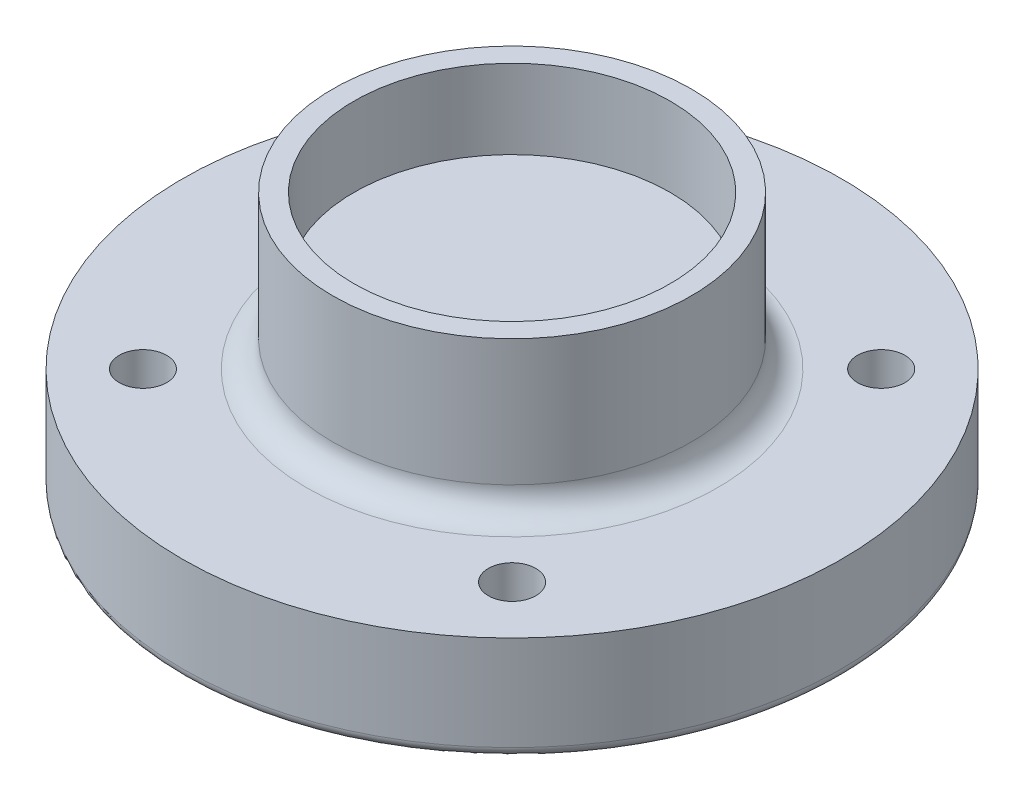
ISO-10303-21;
HEADER;
FILE_DESCRIPTION(('STEP AP214'),'2;1');
FILE_NAME('part.step','',(''),(''),'','','');
FILE_SCHEMA(('AUTOMOTIVE_DESIGN { 1 0 10303 214 1 1 1 1 }'));
ENDSEC;
DATA;
#1=APPLICATION_CONTEXT('core data for automotive mechanical design processes');
#2=APPLICATION_PROTOCOL_DEFINITION('international standard','automotive_design',2000,#1);
#3=PRODUCT_CONTEXT('',#1,'mechanical');
#4=PRODUCT('Part','Part','',(#3));
#5=PRODUCT_RELATED_PRODUCT_CATEGORY('part','',(#4));
#6=PRODUCT_DEFINITION_FORMATION('','',#4);
#7=PRODUCT_DEFINITION_CONTEXT('part definition',#1,'design');
#8=PRODUCT_DEFINITION('design','',#6,#7);
#9=PRODUCT_DEFINITION_SHAPE('','',#8);
#10=(LENGTH_UNIT() NAMED_UNIT(*) SI_UNIT(.MILLI.,.METRE.));
#11=(NAMED_UNIT(*) PLANE_ANGLE_UNIT() SI_UNIT($,.RADIAN.));
#12=(NAMED_UNIT(*) SI_UNIT($,.STERADIAN.) SOLID_ANGLE_UNIT());
#13=UNCERTAINTY_MEASURE_WITH_UNIT(LENGTH_MEASURE(1.E-05),#10,'distance_accuracy_value','');
#14=(GEOMETRIC_REPRESENTATION_CONTEXT(3) GLOBAL_UNCERTAINTY_ASSIGNED_CONTEXT((#13)) GLOBAL_UNIT_ASSIGNED_CONTEXT((#10,
#11,#12)) REPRESENTATION_CONTEXT('',''));
#15=CARTESIAN_POINT('',(0.,0.,0.));
#16=DIRECTION('',(0.,0.,1.));
#17=DIRECTION('',(1.,0.,0.));
#18=AXIS2_PLACEMENT_3D('',#15,#16,#17);
#19=CARTESIAN_POINT('',(0.,20.,0.));
#20=DIRECTION('',(0.,-1.,0.));
#21=DIRECTION('',(0.,0.,-1.));
#22=AXIS2_PLACEMENT_3D('',#19,#20,#21);
#23=CYLINDRICAL_SURFACE('',#22,62.5);
#24=CARTESIAN_POINT('',(0.,2.,0.));
#25=DIRECTION('',(0.,1.,0.));
#26=DIRECTION('',(0.,0.,1.));
#27=AXIS2_PLACEMENT_3D('',#24,#25,#26);
#28=CIRCLE('',#27,62.5);
#29=CARTESIAN_POINT('',(0.,2.,62.5));
#30=VERTEX_POINT('',#29);
#31=EDGE_CURVE('E38',#30,#30,#28,.T.);
#32=ORIENTED_EDGE('',*,*,#31,.T.);
#33=EDGE_LOOP('',(#32));
#34=FACE_BOUND('',#33,.T.);
#35=CARTESIAN_POINT('',(0.,20.,0.));
#36=DIRECTION('',(0.,1.,0.));
#37=DIRECTION('',(0.,0.,1.));
#38=AXIS2_PLACEMENT_3D('',#35,#36,#37);
#39=CIRCLE('',#38,62.5);
#40=CARTESIAN_POINT('',(0.,20.,62.5));
#41=VERTEX_POINT('',#40);
#42=EDGE_CURVE('E71',#41,#41,#39,.T.);
#43=ORIENTED_EDGE('',*,*,#42,.F.);
#44=EDGE_LOOP('',(#43));
#45=FACE_BOUND('',#44,.T.);
#46=ADVANCED_FACE('F31',(#34,#45),#23,.T.);
#47=CARTESIAN_POINT('',(0.,20.,0.));
#48=DIRECTION('',(0.,1.,0.));
#49=DIRECTION('',(0.,0.,1.));
#50=AXIS2_PLACEMENT_3D('',#47,#48,#49);
#51=PLANE('',#50);
#52=CARTESIAN_POINT('',(-35.,20.,35.));
#53=DIRECTION('',(0.,1.,0.));
#54=DIRECTION('',(0.,0.,1.));
#55=AXIS2_PLACEMENT_3D('',#52,#53,#54);
#56=CIRCLE('',#55,4.5);
#57=CARTESIAN_POINT('',(-35.,20.,39.5));
#58=VERTEX_POINT('',#57);
#59=EDGE_CURVE('E49',#58,#58,#56,.T.);
#60=ORIENTED_EDGE('',*,*,#59,.F.);
#61=EDGE_LOOP('',(#60));
#62=FACE_BOUND('',#61,.T.);
#63=CARTESIAN_POINT('',(35.,20.,35.));
#64=DIRECTION('',(0.,1.,0.));
#65=DIRECTION('',(0.,0.,1.));
#66=AXIS2_PLACEMENT_3D('',#63,#64,#65);
#67=CIRCLE('',#66,4.5);
#68=CARTESIAN_POINT('',(35.,20.,39.5));
#69=VERTEX_POINT('',#68);
#70=EDGE_CURVE('E54',#69,#69,#67,.T.);
#71=ORIENTED_EDGE('',*,*,#70,.F.);
#72=EDGE_LOOP('',(#71));
#73=FACE_BOUND('',#72,.T.);
#74=CARTESIAN_POINT('',(35.,20.,-35.));
#75=DIRECTION('',(0.,1.,0.));
#76=DIRECTION('',(0.,0.,1.));
#77=AXIS2_PLACEMENT_3D('',#74,#75,#76);
#78=CIRCLE('',#77,4.5);
#79=CARTESIAN_POINT('',(35.,20.,-30.5));
#80=VERTEX_POINT('',#79);
#81=EDGE_CURVE('E59',#80,#80,#78,.T.);
#82=ORIENTED_EDGE('',*,*,#81,.F.);
#83=EDGE_LOOP('',(#82));
#84=FACE_BOUND('',#83,.T.);
#85=CARTESIAN_POINT('',(-35.,20.,-35.));
#86=DIRECTION('',(0.,1.,0.));
#87=DIRECTION('',(0.,0.,1.));
#88=AXIS2_PLACEMENT_3D('',#85,#86,#87);
#89=CIRCLE('',#88,4.5);
#90=CARTESIAN_POINT('',(-35.,20.,-30.5));
#91=VERTEX_POINT('',#90);
#92=EDGE_CURVE('E64',#91,#91,#89,.T.);
#93=ORIENTED_EDGE('',*,*,#92,.F.);
#94=EDGE_LOOP('',(#93));
#95=FACE_BOUND('',#94,.T.);
#96=CARTESIAN_POINT('',(0.,20.,0.));
#97=DIRECTION('',(0.,1.,0.));
#98=DIRECTION('',(0.,0.,1.));
#99=AXIS2_PLACEMENT_3D('',#96,#97,#98);
#100=CIRCLE('',#99,39.);
#101=CARTESIAN_POINT('',(0.,20.,39.));
#102=VERTEX_POINT('',#101);
#103=EDGE_CURVE('E42',#102,#102,#100,.F.);
#104=ORIENTED_EDGE('',*,*,#103,.T.);
#105=EDGE_LOOP('',(#104));
#106=FACE_BOUND('',#105,.T.);
#107=ORIENTED_EDGE('',*,*,#42,.T.);
#108=EDGE_LOOP('',(#107));
#109=FACE_BOUND('',#108,.T.);
#110=ADVANCED_FACE('F118',(#62,#73,#84,#95,#106,#109),#51,.T.);
#111=CARTESIAN_POINT('',(0.,0.,0.));
#112=DIRECTION('',(0.,1.,0.));
#113=DIRECTION('',(0.,0.,1.));
#114=AXIS2_PLACEMENT_3D('',#111,#112,#113);
#115=PLANE('',#114);
#116=CARTESIAN_POINT('',(0.,0.,0.));
#117=DIRECTION('',(0.,1.,0.));
#118=DIRECTION('',(0.,0.,1.));
#119=AXIS2_PLACEMENT_3D('',#116,#117,#118);
#120=CIRCLE('',#119,60.5);
#121=CARTESIAN_POINT('',(0.,0.,60.5));
#122=VERTEX_POINT('',#121);
#123=EDGE_CURVE('E10',#122,#122,#120,.F.);
#124=ORIENTED_EDGE('',*,*,#123,.T.);
#125=EDGE_LOOP('',(#124));
#126=FACE_BOUND('',#125,.T.);
#127=CARTESIAN_POINT('',(-35.,0.,35.));
#128=DIRECTION('',(0.,-1.,0.));
#129=DIRECTION('',(0.,0.,-1.));
#130=AXIS2_PLACEMENT_3D('',#127,#128,#129);
#131=CIRCLE('',#130,9.0055);
#132=CARTESIAN_POINT('',(-35.,0.,25.9945));
#133=VERTEX_POINT('',#132);
#134=EDGE_CURVE('E108',#133,#133,#131,.T.);
#135=ORIENTED_EDGE('',*,*,#134,.F.);
#136=EDGE_LOOP('',(#135));
#137=FACE_BOUND('',#136,.T.);
#138=CARTESIAN_POINT('',(35.,0.,35.));
#139=DIRECTION('',(0.,-1.,0.));
#140=DIRECTION('',(0.,0.,-1.));
#141=AXIS2_PLACEMENT_3D('',#138,#139,#140);
#142=CIRCLE('',#141,9.0055);
#143=CARTESIAN_POINT('',(35.,0.,25.9945));
#144=VERTEX_POINT('',#143);
#145=EDGE_CURVE('E52',#144,#144,#142,.T.);
#146=ORIENTED_EDGE('',*,*,#145,.F.);
#147=EDGE_LOOP('',(#146));
#148=FACE_BOUND('',#147,.T.);
#149=CARTESIAN_POINT('',(35.,0.,-35.));
#150=DIRECTION('',(0.,-1.,0.));
#151=DIRECTION('',(0.,0.,-1.));
#152=AXIS2_PLACEMENT_3D('',#149,#150,#151);
#153=CIRCLE('',#152,9.0055);
#154=CARTESIAN_POINT('',(35.,0.,-44.0055));
#155=VERTEX_POINT('',#154);
#156=EDGE_CURVE('E57',#155,#155,#153,.T.);
#157=ORIENTED_EDGE('',*,*,#156,.F.);
#158=EDGE_LOOP('',(#157));
#159=FACE_BOUND('',#158,.T.);
#160=CARTESIAN_POINT('',(-35.,0.,-35.));
#161=DIRECTION('',(0.,-1.,0.));
#162=DIRECTION('',(0.,0.,-1.));
#163=AXIS2_PLACEMENT_3D('',#160,#161,#162);
#164=CIRCLE('',#163,9.0055);
#165=CARTESIAN_POINT('',(-35.,0.,-44.0055));
#166=VERTEX_POINT('',#165);
#167=EDGE_CURVE('E62',#166,#166,#164,.T.);
#168=ORIENTED_EDGE('',*,*,#167,.F.);
#169=EDGE_LOOP('',(#168));
#170=FACE_BOUND('',#169,.T.);
#171=ADVANCED_FACE('F114',(#126,#137,#148,#159,#170),#115,.F.);
#172=CARTESIAN_POINT('',(0.,49.,0.));
#173=DIRECTION('',(0.,-1.,0.));
#174=DIRECTION('',(0.,0.,-1.));
#175=AXIS2_PLACEMENT_3D('',#172,#173,#174);
#176=CYLINDRICAL_SURFACE('',#175,34.);
#177=CARTESIAN_POINT('',(0.,25.,0.));
#178=DIRECTION('',(0.,1.,0.));
#179=DIRECTION('',(0.,0.,1.));
#180=AXIS2_PLACEMENT_3D('',#177,#178,#179);
#181=CIRCLE('',#180,34.);
#182=CARTESIAN_POINT('',(0.,25.,-34.));
#183=VERTEX_POINT('',#182);
#184=EDGE_CURVE('E46',#183,#183,#181,.T.);
#185=CARTESIAN_POINT('',(0.,49.,0.));
#186=DIRECTION('',(0.,1.,0.));
#187=DIRECTION('',(0.,0.,1.));
#188=AXIS2_PLACEMENT_3D('',#185,#186,#187);
#189=CIRCLE('',#188,34.);
#190=CARTESIAN_POINT('',(0.,49.,-34.));
#191=VERTEX_POINT('',#190);
#192=EDGE_CURVE('E74',#191,#191,#189,.T.);
#193=CARTESIAN_POINT('',(0.,25.,-34.));
#194=CARTESIAN_POINT('',(0.,25.25,-34.));
#195=CARTESIAN_POINT('',(0.,25.5,-34.));
#196=CARTESIAN_POINT('',(0.,26.,-34.));
#197=CARTESIAN_POINT('',(0.,26.25,-34.));
#198=CARTESIAN_POINT('',(0.,26.75,-34.));
#199=CARTESIAN_POINT('',(0.,27.,-34.));
#200=CARTESIAN_POINT('',(0.,27.5,-34.));
#201=CARTESIAN_POINT('',(0.,27.75,-34.));
#202=CARTESIAN_POINT('',(0.,28.25,-34.));
#203=CARTESIAN_POINT('',(0.,28.5,-34.));
#204=CARTESIAN_POINT('',(0.,29.,-34.));
#205=CARTESIAN_POINT('',(0.,29.25,-34.));
#206=CARTESIAN_POINT('',(0.,29.75,-34.));
#207=CARTESIAN_POINT('',(0.,30.,-34.));
#208=CARTESIAN_POINT('',(0.,30.5,-34.));
#209=CARTESIAN_POINT('',(0.,30.75,-34.));
#210=CARTESIAN_POINT('',(0.,31.25,-34.));
#211=CARTESIAN_POINT('',(0.,31.5,-34.));
#212=CARTESIAN_POINT('',(0.,32.,-34.));
#213=CARTESIAN_POINT('',(0.,32.25,-34.));
#214=CARTESIAN_POINT('',(0.,32.75,-34.));
#215=CARTESIAN_POINT('',(0.,33.,-34.));
#216=CARTESIAN_POINT('',(0.,33.5,-34.));
#217=CARTESIAN_POINT('',(0.,33.75,-34.));
#218=CARTESIAN_POINT('',(0.,34.25,-34.));
#219=CARTESIAN_POINT('',(0.,34.5,-34.));
#220=CARTESIAN_POINT('',(0.,35.,-34.));
#221=CARTESIAN_POINT('',(0.,35.25,-34.));
#222=CARTESIAN_POINT('',(0.,35.75,-34.));
#223=CARTESIAN_POINT('',(0.,36.,-34.));
#224=CARTESIAN_POINT('',(0.,36.5,-34.));
#225=CARTESIAN_POINT('',(0.,36.75,-34.));
#226=CARTESIAN_POINT('',(0.,37.25,-34.));
#227=CARTESIAN_POINT('',(0.,37.5,-34.));
#228=CARTESIAN_POINT('',(0.,38.,-34.));
#229=CARTESIAN_POINT('',(0.,38.25,-34.));
#230=CARTESIAN_POINT('',(0.,38.75,-34.));
#231=CARTESIAN_POINT('',(0.,39.,-34.));
#232=CARTESIAN_POINT('',(0.,39.5,-34.));
#233=CARTESIAN_POINT('',(0.,39.75,-34.));
#234=CARTESIAN_POINT('',(0.,40.25,-34.));
#235=CARTESIAN_POINT('',(0.,40.5,-34.));
#236=CARTESIAN_POINT('',(0.,41.,-34.));
#237=CARTESIAN_POINT('',(0.,41.25,-34.));
#238=CARTESIAN_POINT('',(0.,41.75,-34.));
#239=CARTESIAN_POINT('',(0.,42.,-34.));
#240=CARTESIAN_POINT('',(0.,42.5,-34.));
#241=CARTESIAN_POINT('',(0.,42.75,-34.));
#242=CARTESIAN_POINT('',(0.,43.25,-34.));
#243=CARTESIAN_POINT('',(0.,43.5,-34.));
#244=CARTESIAN_POINT('',(0.,44.,-34.));
#245=CARTESIAN_POINT('',(0.,44.25,-34.));
#246=CARTESIAN_POINT('',(0.,44.75,-34.));
#247=CARTESIAN_POINT('',(0.,45.,-34.));
#248=CARTESIAN_POINT('',(0.,45.5,-34.));
#249=CARTESIAN_POINT('',(0.,45.75,-34.));
#250=CARTESIAN_POINT('',(0.,46.25,-34.));
#251=CARTESIAN_POINT('',(0.,46.5,-34.));
#252=CARTESIAN_POINT('',(0.,47.,-34.));
#253=CARTESIAN_POINT('',(0.,47.25,-34.));
#254=CARTESIAN_POINT('',(0.,47.75,-34.));
#255=CARTESIAN_POINT('',(0.,48.,-34.));
#256=CARTESIAN_POINT('',(0.,48.5,-34.));
#257=CARTESIAN_POINT('',(0.,48.75,-34.));
#258=CARTESIAN_POINT('',(0.,49.,-34.));
#259=B_SPLINE_CURVE_WITH_KNOTS('',3,(#193,#194,#195,#196,#197,#198,#199,#200,#201,#202,#203,
#204,#205,#206,#207,#208,#209,#210,#211,#212,#213,#214,#215,#216,#217,#218,#219,#220,#221,#222,
#223,#224,#225,#226,#227,#228,#229,#230,#231,#232,#233,#234,#235,#236,#237,#238,#239,#240,#241,
#242,#243,#244,#245,#246,#247,#248,#249,#250,#251,#252,#253,#254,#255,#256,#257,#258),
.UNSPECIFIED.,.F.,.F.,(4,2,2,2,2,2,2,2,2,2,2,2,2,2,2,2,2,2,2,2,2,2,2,2,2,2,2,2,2,2,2,2,4),(0.,
0.750000000000001,1.5,2.25,3.,3.75,4.5,5.25,6.,6.75,7.5,8.25,9.,9.75,10.5,11.25,12.,12.75,13.5,
14.25,15.,15.75,16.5,17.25,18.,18.75,19.5,20.25,21.,21.75,22.5,23.25,24.),.UNSPECIFIED.);
#260=EDGE_CURVE('BSEAM117',#183,#191,#259,.T.);
#261=ORIENTED_EDGE('',*,*,#184,.T.);
#262=ORIENTED_EDGE('',*,*,#192,.F.);
#263=ORIENTED_EDGE('',*,*,#260,.T.);
#264=ORIENTED_EDGE('',*,*,#260,.F.);
#265=EDGE_LOOP('',(#261,#263,#262,#264));
#266=FACE_BOUND('',#265,.T.);
#267=ADVANCED_FACE('F117',(#266),#176,.T.);
#268=CARTESIAN_POINT('',(0.,49.,0.));
#269=DIRECTION('',(0.,1.,0.));
#270=DIRECTION('',(0.,0.,1.));
#271=AXIS2_PLACEMENT_3D('',#268,#269,#270);
#272=PLANE('',#271);
#273=CARTESIAN_POINT('',(0.,49.,0.));
#274=DIRECTION('',(0.,1.,0.));
#275=DIRECTION('',(0.,0.,1.));
#276=AXIS2_PLACEMENT_3D('',#273,#274,#275);
#277=CIRCLE('',#276,30.);
#278=CARTESIAN_POINT('',(0.,49.,30.));
#279=VERTEX_POINT('',#278);
#280=EDGE_CURVE('E66',#279,#279,#277,.T.);
#281=ORIENTED_EDGE('',*,*,#280,.F.);
#282=EDGE_LOOP('',(#281));
#283=FACE_BOUND('',#282,.T.);
#284=ORIENTED_EDGE('',*,*,#192,.T.);
#285=EDGE_LOOP('',(#284));
#286=FACE_BOUND('',#285,.T.);
#287=ADVANCED_FACE('F170',(#283,#286),#272,.T.);
#288=CARTESIAN_POINT('',(0.,34.,0.));
#289=DIRECTION('',(0.,1.,0.));
#290=DIRECTION('',(0.,0.,1.));
#291=AXIS2_PLACEMENT_3D('',#288,#289,#290);
#292=CYLINDRICAL_SURFACE('',#291,30.);
#293=CARTESIAN_POINT('',(0.,34.,0.));
#294=DIRECTION('',(0.,1.,0.));
#295=DIRECTION('',(0.,0.,1.));
#296=AXIS2_PLACEMENT_3D('',#293,#294,#295);
#297=CIRCLE('',#296,30.);
#298=CARTESIAN_POINT('',(0.,34.,30.));
#299=VERTEX_POINT('',#298);
#300=EDGE_CURVE('E77',#299,#299,#297,.T.);
#301=ORIENTED_EDGE('',*,*,#300,.F.);
#302=EDGE_LOOP('',(#301));
#303=FACE_BOUND('',#302,.T.);
#304=ORIENTED_EDGE('',*,*,#280,.T.);
#305=EDGE_LOOP('',(#304));
#306=FACE_BOUND('',#305,.T.);
#307=ADVANCED_FACE('F161',(#303,#306),#292,.F.);
#308=CARTESIAN_POINT('',(0.,34.,0.));
#309=DIRECTION('',(0.,1.,0.));
#310=DIRECTION('',(0.,0.,1.));
#311=AXIS2_PLACEMENT_3D('',#308,#309,#310);
#312=PLANE('',#311);
#313=ORIENTED_EDGE('',*,*,#300,.T.);
#314=EDGE_LOOP('',(#313));
#315=FACE_BOUND('',#314,.T.);
#316=ADVANCED_FACE('F153',(#315),#312,.T.);
#317=CARTESIAN_POINT('',(0.,25.,0.));
#318=DIRECTION('',(0.,1.,0.));
#319=DIRECTION('',(0.,0.,1.));
#320=AXIS2_PLACEMENT_3D('',#317,#318,#319);
#321=TOROIDAL_SURFACE('',#320,39.,5.);
#322=ORIENTED_EDGE('',*,*,#103,.F.);
#323=EDGE_LOOP('',(#322));
#324=FACE_BOUND('',#323,.T.);
#325=ORIENTED_EDGE('',*,*,#184,.F.);
#326=EDGE_LOOP('',(#325));
#327=FACE_BOUND('',#326,.T.);
#328=ADVANCED_FACE('F151',(#324,#327),#321,.F.);
#329=CARTESIAN_POINT('',(-35.,0.,-35.));
#330=DIRECTION('',(0.,-1.,0.));
#331=DIRECTION('',(0.,0.,-1.));
#332=AXIS2_PLACEMENT_3D('',#329,#330,#331);
#333=CYLINDRICAL_SURFACE('',#332,4.5);
#334=ORIENTED_EDGE('',*,*,#92,.T.);
#335=EDGE_LOOP('',(#334));
#336=FACE_BOUND('',#335,.T.);
#337=CARTESIAN_POINT('',(-35.,5.3,-35.));
#338=DIRECTION('',(0.,-1.,0.));
#339=DIRECTION('',(0.,0.,-1.));
#340=AXIS2_PLACEMENT_3D('',#337,#338,#339);
#341=CIRCLE('',#340,4.50000000000001);
#342=CARTESIAN_POINT('',(-35.,5.3,-39.5));
#343=VERTEX_POINT('',#342);
#344=EDGE_CURVE('E67',#343,#343,#341,.T.);
#345=ORIENTED_EDGE('',*,*,#344,.T.);
#346=EDGE_LOOP('',(#345));
#347=FACE_BOUND('',#346,.T.);
#348=ADVANCED_FACE('F139',(#336,#347),#333,.F.);
#349=CARTESIAN_POINT('',(-30.5,5.3,-35.));
#350=DIRECTION('',(0.,1.,0.));
#351=DIRECTION('',(0.,0.,1.));
#352=AXIS2_PLACEMENT_3D('',#349,#350,#351);
#353=PLANE('',#352);
#354=ORIENTED_EDGE('',*,*,#344,.F.);
#355=EDGE_LOOP('',(#354));
#356=FACE_BOUND('',#355,.T.);
#357=CARTESIAN_POINT('',(-35.,5.3,-35.));
#358=DIRECTION('',(0.,-1.,0.));
#359=DIRECTION('',(0.,0.,-1.));
#360=AXIS2_PLACEMENT_3D('',#357,#358,#359);
#361=CIRCLE('',#360,9.0055);
#362=CARTESIAN_POINT('',(-35.,5.3,-44.0055));
#363=VERTEX_POINT('',#362);
#364=EDGE_CURVE('E84',#363,#363,#361,.T.);
#365=ORIENTED_EDGE('',*,*,#364,.T.);
#366=EDGE_LOOP('',(#365));
#367=FACE_BOUND('',#366,.T.);
#368=ADVANCED_FACE('F129',(#356,#367),#353,.F.);
#369=CARTESIAN_POINT('',(-35.,0.,-35.));
#370=DIRECTION('',(0.,-1.,0.));
#371=DIRECTION('',(0.,0.,-1.));
#372=AXIS2_PLACEMENT_3D('',#369,#370,#371);
#373=CYLINDRICAL_SURFACE('',#372,9.0055);
#374=ORIENTED_EDGE('',*,*,#364,.F.);
#375=EDGE_LOOP('',(#374));
#376=FACE_BOUND('',#375,.T.);
#377=ORIENTED_EDGE('',*,*,#167,.T.);
#378=EDGE_LOOP('',(#377));
#379=FACE_BOUND('',#378,.T.);
#380=ADVANCED_FACE('F126',(#376,#379),#373,.F.);
#381=CARTESIAN_POINT('',(35.,0.,-35.));
#382=DIRECTION('',(0.,-1.,0.));
#383=DIRECTION('',(0.,0.,-1.));
#384=AXIS2_PLACEMENT_3D('',#381,#382,#383);
#385=CYLINDRICAL_SURFACE('',#384,4.5);
#386=ORIENTED_EDGE('',*,*,#81,.T.);
#387=EDGE_LOOP('',(#386));
#388=FACE_BOUND('',#387,.T.);
#389=CARTESIAN_POINT('',(35.,5.3,-35.));
#390=DIRECTION('',(0.,-1.,0.));
#391=DIRECTION('',(0.,0.,-1.));
#392=AXIS2_PLACEMENT_3D('',#389,#390,#391);
#393=CIRCLE('',#392,4.50000000000001);
#394=CARTESIAN_POINT('',(35.,5.3,-39.5));
#395=VERTEX_POINT('',#394);
#396=EDGE_CURVE('E63',#395,#395,#393,.T.);
#397=ORIENTED_EDGE('',*,*,#396,.T.);
#398=EDGE_LOOP('',(#397));
#399=FACE_BOUND('',#398,.T.);
#400=ADVANCED_FACE('F128',(#388,#399),#385,.F.);
#401=CARTESIAN_POINT('',(39.5,5.3,-35.));
#402=DIRECTION('',(0.,1.,0.));
#403=DIRECTION('',(0.,0.,1.));
#404=AXIS2_PLACEMENT_3D('',#401,#402,#403);
#405=PLANE('',#404);
#406=ORIENTED_EDGE('',*,*,#396,.F.);
#407=EDGE_LOOP('',(#406));
#408=FACE_BOUND('',#407,.T.);
#409=CARTESIAN_POINT('',(35.,5.3,-35.));
#410=DIRECTION('',(0.,-1.,0.));
#411=DIRECTION('',(0.,0.,-1.));
#412=AXIS2_PLACEMENT_3D('',#409,#410,#411);
#413=CIRCLE('',#412,9.0055);
#414=CARTESIAN_POINT('',(35.,5.3,-44.0055));
#415=VERTEX_POINT('',#414);
#416=EDGE_CURVE('E91',#415,#415,#413,.T.);
#417=ORIENTED_EDGE('',*,*,#416,.T.);
#418=EDGE_LOOP('',(#417));
#419=FACE_BOUND('',#418,.T.);
#420=ADVANCED_FACE('F136',(#408,#419),#405,.F.);
#421=CARTESIAN_POINT('',(35.,0.,-35.));
#422=DIRECTION('',(0.,-1.,0.));
#423=DIRECTION('',(0.,0.,-1.));
#424=AXIS2_PLACEMENT_3D('',#421,#422,#423);
#425=CYLINDRICAL_SURFACE('',#424,9.0055);
#426=ORIENTED_EDGE('',*,*,#416,.F.);
#427=EDGE_LOOP('',(#426));
#428=FACE_BOUND('',#427,.T.);
#429=ORIENTED_EDGE('',*,*,#156,.T.);
#430=EDGE_LOOP('',(#429));
#431=FACE_BOUND('',#430,.T.);
#432=ADVANCED_FACE('F241',(#428,#431),#425,.F.);
#433=CARTESIAN_POINT('',(35.,0.,35.));
#434=DIRECTION('',(0.,-1.,0.));
#435=DIRECTION('',(0.,0.,-1.));
#436=AXIS2_PLACEMENT_3D('',#433,#434,#435);
#437=CYLINDRICAL_SURFACE('',#436,4.5);
#438=ORIENTED_EDGE('',*,*,#70,.T.);
#439=EDGE_LOOP('',(#438));
#440=FACE_BOUND('',#439,.T.);
#441=CARTESIAN_POINT('',(35.,5.3,35.));
#442=DIRECTION('',(0.,-1.,0.));
#443=DIRECTION('',(0.,0.,-1.));
#444=AXIS2_PLACEMENT_3D('',#441,#442,#443);
#445=CIRCLE('',#444,4.50000000000001);
#446=CARTESIAN_POINT('',(35.,5.3,30.5));
#447=VERTEX_POINT('',#446);
#448=EDGE_CURVE('E58',#447,#447,#445,.T.);
#449=ORIENTED_EDGE('',*,*,#448,.T.);
#450=EDGE_LOOP('',(#449));
#451=FACE_BOUND('',#450,.T.);
#452=ADVANCED_FACE('F251',(#440,#451),#437,.F.);
#453=CARTESIAN_POINT('',(39.5,5.3,35.));
#454=DIRECTION('',(0.,1.,0.));
#455=DIRECTION('',(0.,0.,1.));
#456=AXIS2_PLACEMENT_3D('',#453,#454,#455);
#457=PLANE('',#456);
#458=ORIENTED_EDGE('',*,*,#448,.F.);
#459=EDGE_LOOP('',(#458));
#460=FACE_BOUND('',#459,.T.);
#461=CARTESIAN_POINT('',(35.,5.3,35.));
#462=DIRECTION('',(0.,-1.,0.));
#463=DIRECTION('',(0.,0.,-1.));
#464=AXIS2_PLACEMENT_3D('',#461,#462,#463);
#465=CIRCLE('',#464,9.0055);
#466=CARTESIAN_POINT('',(35.,5.3,25.9945));
#467=VERTEX_POINT('',#466);
#468=EDGE_CURVE('E98',#467,#467,#465,.T.);
#469=ORIENTED_EDGE('',*,*,#468,.T.);
#470=EDGE_LOOP('',(#469));
#471=FACE_BOUND('',#470,.T.);
#472=ADVANCED_FACE('F261',(#460,#471),#457,.F.);
#473=CARTESIAN_POINT('',(35.,0.,35.));
#474=DIRECTION('',(0.,-1.,0.));
#475=DIRECTION('',(0.,0.,-1.));
#476=AXIS2_PLACEMENT_3D('',#473,#474,#475);
#477=CYLINDRICAL_SURFACE('',#476,9.0055);
#478=ORIENTED_EDGE('',*,*,#468,.F.);
#479=EDGE_LOOP('',(#478));
#480=FACE_BOUND('',#479,.T.);
#481=ORIENTED_EDGE('',*,*,#145,.T.);
#482=EDGE_LOOP('',(#481));
#483=FACE_BOUND('',#482,.T.);
#484=ADVANCED_FACE('F271',(#480,#483),#477,.F.);
#485=CARTESIAN_POINT('',(-35.,0.,35.));
#486=DIRECTION('',(0.,-1.,0.));
#487=DIRECTION('',(0.,0.,-1.));
#488=AXIS2_PLACEMENT_3D('',#485,#486,#487);
#489=CYLINDRICAL_SURFACE('',#488,4.5);
#490=ORIENTED_EDGE('',*,*,#59,.T.);
#491=EDGE_LOOP('',(#490));
#492=FACE_BOUND('',#491,.T.);
#493=CARTESIAN_POINT('',(-35.,5.3,35.));
#494=DIRECTION('',(0.,-1.,0.));
#495=DIRECTION('',(0.,0.,-1.));
#496=AXIS2_PLACEMENT_3D('',#493,#494,#495);
#497=CIRCLE('',#496,4.50000000000001);
#498=CARTESIAN_POINT('',(-35.,5.3,30.5));
#499=VERTEX_POINT('',#498);
#500=EDGE_CURVE('E53',#499,#499,#497,.T.);
#501=ORIENTED_EDGE('',*,*,#500,.T.);
#502=EDGE_LOOP('',(#501));
#503=FACE_BOUND('',#502,.T.);
#504=ADVANCED_FACE('F281',(#492,#503),#489,.F.);
#505=CARTESIAN_POINT('',(-30.5,5.3,35.));
#506=DIRECTION('',(0.,1.,0.));
#507=DIRECTION('',(0.,0.,1.));
#508=AXIS2_PLACEMENT_3D('',#505,#506,#507);
#509=PLANE('',#508);
#510=ORIENTED_EDGE('',*,*,#500,.F.);
#511=EDGE_LOOP('',(#510));
#512=FACE_BOUND('',#511,.T.);
#513=CARTESIAN_POINT('',(-35.,5.3,35.));
#514=DIRECTION('',(0.,-1.,0.));
#515=DIRECTION('',(0.,0.,-1.));
#516=AXIS2_PLACEMENT_3D('',#513,#514,#515);
#517=CIRCLE('',#516,9.0055);
#518=CARTESIAN_POINT('',(-35.,5.3,25.9945));
#519=VERTEX_POINT('',#518);
#520=EDGE_CURVE('E105',#519,#519,#517,.T.);
#521=ORIENTED_EDGE('',*,*,#520,.T.);
#522=EDGE_LOOP('',(#521));
#523=FACE_BOUND('',#522,.T.);
#524=ADVANCED_FACE('F291',(#512,#523),#509,.F.);
#525=CARTESIAN_POINT('',(-35.,0.,35.));
#526=DIRECTION('',(0.,-1.,0.));
#527=DIRECTION('',(0.,0.,-1.));
#528=AXIS2_PLACEMENT_3D('',#525,#526,#527);
#529=CYLINDRICAL_SURFACE('',#528,9.0055);
#530=ORIENTED_EDGE('',*,*,#520,.F.);
#531=EDGE_LOOP('',(#530));
#532=FACE_BOUND('',#531,.T.);
#533=ORIENTED_EDGE('',*,*,#134,.T.);
#534=EDGE_LOOP('',(#533));
#535=FACE_BOUND('',#534,.T.);
#536=ADVANCED_FACE('F112',(#532,#535),#529,.F.);
#537=CARTESIAN_POINT('',(0.,2.,0.));
#538=DIRECTION('',(0.,1.,0.));
#539=DIRECTION('',(0.,0.,1.));
#540=AXIS2_PLACEMENT_3D('',#537,#538,#539);
#541=TOROIDAL_SURFACE('',#540,60.5,2.);
#542=ORIENTED_EDGE('',*,*,#123,.F.);
#543=EDGE_LOOP('',(#542));
#544=FACE_BOUND('',#543,.T.);
#545=ORIENTED_EDGE('',*,*,#31,.F.);
#546=EDGE_LOOP('',(#545));
#547=FACE_BOUND('',#546,.T.);
#548=ADVANCED_FACE('F33',(#544,#547),#541,.T.);
#549=CLOSED_SHELL('',(#46,#110,#171,#267,#287,#307,#316,#328,#348,#368,#380,#400,#420,#432,#452,
#472,#484,#504,#524,#536,#548));
#550=MANIFOLD_SOLID_BREP('B2',#549);
#551=ADVANCED_BREP_SHAPE_REPRESENTATION('',(#18,#550),#14);
#552=SHAPE_DEFINITION_REPRESENTATION(#9,#551);
ENDSEC;
END-ISO-10303-21;
